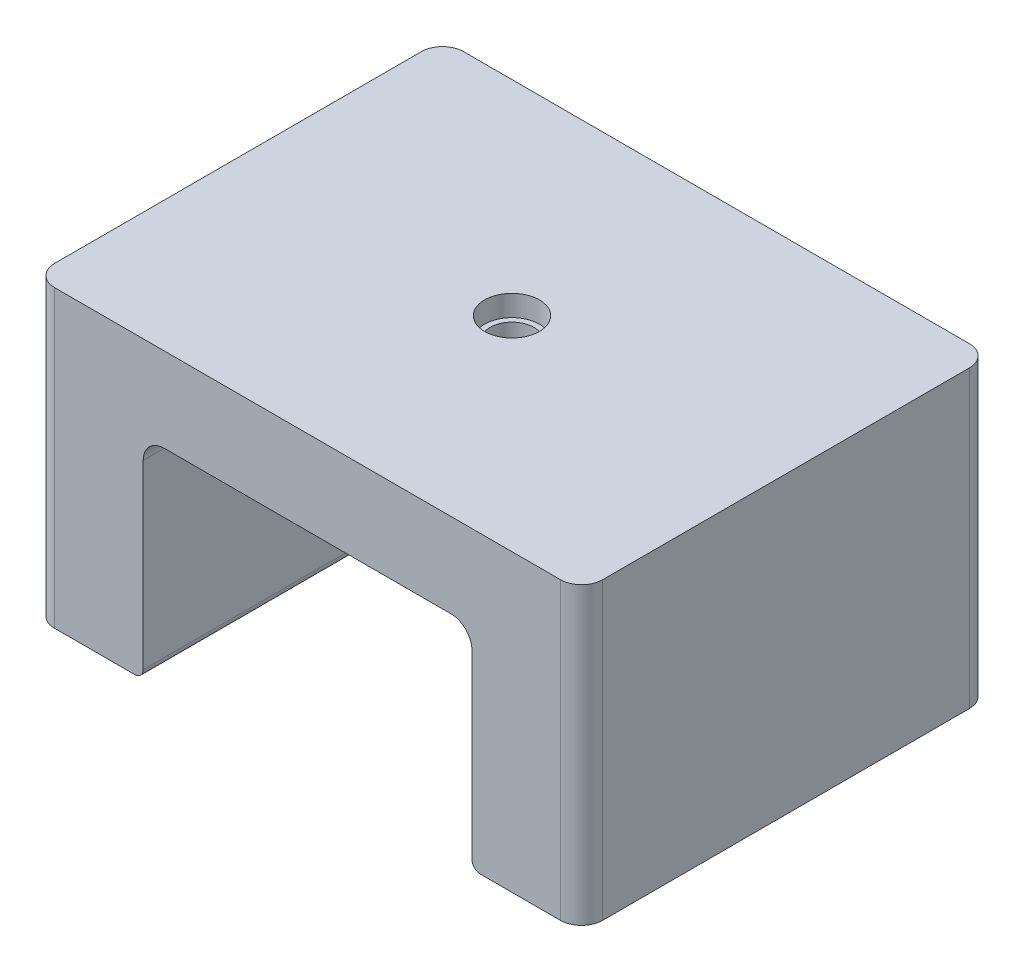
ISO-10303-21;
HEADER;
FILE_DESCRIPTION(('STEP AP214'),'2;1');
FILE_NAME('part.step','',(''),(''),'','','');
FILE_SCHEMA(('AUTOMOTIVE_DESIGN { 1 0 10303 214 1 1 1 1 }'));
ENDSEC;
DATA;
#1=APPLICATION_CONTEXT('core data for automotive mechanical design processes');
#2=APPLICATION_PROTOCOL_DEFINITION('international standard','automotive_design',2000,#1);
#3=PRODUCT_CONTEXT('',#1,'mechanical');
#4=PRODUCT('Part','Part','',(#3));
#5=PRODUCT_RELATED_PRODUCT_CATEGORY('part','',(#4));
#6=PRODUCT_DEFINITION_FORMATION('','',#4);
#7=PRODUCT_DEFINITION_CONTEXT('part definition',#1,'design');
#8=PRODUCT_DEFINITION('design','',#6,#7);
#9=PRODUCT_DEFINITION_SHAPE('','',#8);
#10=(LENGTH_UNIT() NAMED_UNIT(*) SI_UNIT(.MILLI.,.METRE.));
#11=(NAMED_UNIT(*) PLANE_ANGLE_UNIT() SI_UNIT($,.RADIAN.));
#12=(NAMED_UNIT(*) SI_UNIT($,.STERADIAN.) SOLID_ANGLE_UNIT());
#13=UNCERTAINTY_MEASURE_WITH_UNIT(LENGTH_MEASURE(1.E-05),#10,'distance_accuracy_value','');
#14=(GEOMETRIC_REPRESENTATION_CONTEXT(3) GLOBAL_UNCERTAINTY_ASSIGNED_CONTEXT((#13)) GLOBAL_UNIT_ASSIGNED_CONTEXT((#10,
#11,#12)) REPRESENTATION_CONTEXT('',''));
#15=CARTESIAN_POINT('',(0.,0.,0.));
#16=DIRECTION('',(0.,0.,1.));
#17=DIRECTION('',(1.,0.,0.));
#18=AXIS2_PLACEMENT_3D('',#15,#16,#17);
#19=CARTESIAN_POINT('',(0.,0.,0.));
#20=DIRECTION('',(0.,1.,0.));
#21=DIRECTION('',(0.,0.,1.));
#22=AXIS2_PLACEMENT_3D('',#19,#20,#21);
#23=CYLINDRICAL_SURFACE('',#22,5.2);
#24=CARTESIAN_POINT('',(0.,50.,0.));
#25=DIRECTION('',(0.,1.,0.));
#26=DIRECTION('',(0.,0.,1.));
#27=AXIS2_PLACEMENT_3D('',#24,#25,#26);
#28=CIRCLE('',#27,5.2);
#29=CARTESIAN_POINT('',(0.,50.,5.2));
#30=VERTEX_POINT('',#29);
#31=EDGE_CURVE('E223',#30,#30,#28,.T.);
#32=ORIENTED_EDGE('',*,*,#31,.F.);
#33=EDGE_LOOP('',(#32));
#34=FACE_BOUND('',#33,.T.);
#35=CARTESIAN_POINT('',(0.,65.,0.));
#36=DIRECTION('',(0.,1.,0.));
#37=DIRECTION('',(0.,0.,1.));
#38=AXIS2_PLACEMENT_3D('',#35,#36,#37);
#39=CIRCLE('',#38,5.2);
#40=CARTESIAN_POINT('',(0.,65.,5.2));
#41=VERTEX_POINT('',#40);
#42=EDGE_CURVE('E226',#41,#41,#39,.F.);
#43=ORIENTED_EDGE('',*,*,#42,.F.);
#44=EDGE_LOOP('',(#43));
#45=FACE_BOUND('',#44,.T.);
#46=ADVANCED_FACE('F39',(#34,#45),#23,.F.);
#47=CARTESIAN_POINT('',(0.,0.,0.));
#48=DIRECTION('',(0.,1.,0.));
#49=DIRECTION('',(0.,0.,1.));
#50=AXIS2_PLACEMENT_3D('',#47,#48,#49);
#51=PLANE('',#50);
#52=DIRECTION('',(-1.,0.,0.));
#53=VECTOR('',#52,1.);
#54=CARTESIAN_POINT('',(-65.,0.,-48.5));
#55=LINE('',#54,#53);
#56=CARTESIAN_POINT('',(-41.,0.,-48.5));
#57=VERTEX_POINT('',#56);
#58=CARTESIAN_POINT('',(-60.,0.,-48.5));
#59=VERTEX_POINT('',#58);
#60=EDGE_CURVE('E208',#57,#59,#55,.T.);
#61=ORIENTED_EDGE('',*,*,#60,.F.);
#62=DIRECTION('',(0.,0.,1.));
#63=VECTOR('',#62,1.);
#64=CARTESIAN_POINT('',(-41.,0.,0.));
#65=LINE('',#64,#63);
#66=CARTESIAN_POINT('',(-41.,0.,48.5));
#67=VERTEX_POINT('',#66);
#68=EDGE_CURVE('E47',#57,#67,#65,.T.);
#69=ORIENTED_EDGE('',*,*,#68,.T.);
#70=DIRECTION('',(1.,0.,0.));
#71=VECTOR('',#70,1.);
#72=CARTESIAN_POINT('',(-65.,0.,48.5));
#73=LINE('',#72,#71);
#74=CARTESIAN_POINT('',(-60.,0.,48.5));
#75=VERTEX_POINT('',#74);
#76=EDGE_CURVE('E201',#75,#67,#73,.T.);
#77=ORIENTED_EDGE('',*,*,#76,.F.);
#78=CARTESIAN_POINT('',(-60.,0.,43.5));
#79=DIRECTION('',(0.,1.,0.));
#80=DIRECTION('',(0.,0.,1.));
#81=AXIS2_PLACEMENT_3D('',#78,#79,#80);
#82=CIRCLE('',#81,5.);
#83=CARTESIAN_POINT('',(-65.,0.,43.5));
#84=VERTEX_POINT('',#83);
#85=EDGE_CURVE('E234',#75,#84,#82,.F.);
#86=ORIENTED_EDGE('',*,*,#85,.T.);
#87=DIRECTION('',(0.,0.,1.));
#88=VECTOR('',#87,1.);
#89=CARTESIAN_POINT('',(-65.,0.,48.5));
#90=LINE('',#89,#88);
#91=CARTESIAN_POINT('',(-65.,0.,-43.5));
#92=VERTEX_POINT('',#91);
#93=EDGE_CURVE('E192',#92,#84,#90,.T.);
#94=ORIENTED_EDGE('',*,*,#93,.F.);
#95=CARTESIAN_POINT('',(-60.,0.,-43.5));
#96=DIRECTION('',(0.,1.,0.));
#97=DIRECTION('',(0.,0.,1.));
#98=AXIS2_PLACEMENT_3D('',#95,#96,#97);
#99=CIRCLE('',#98,5.);
#100=EDGE_CURVE('E236',#92,#59,#99,.F.);
#101=ORIENTED_EDGE('',*,*,#100,.T.);
#102=EDGE_LOOP('',(#61,#69,#77,#86,#94,#101));
#103=FACE_BOUND('',#102,.T.);
#104=ADVANCED_FACE('F282',(#103),#51,.F.);
#105=CARTESIAN_POINT('',(-65.,70.,48.5));
#106=DIRECTION('',(0.,0.,-1.));
#107=DIRECTION('',(-1.,0.,0.));
#108=AXIS2_PLACEMENT_3D('',#105,#106,#107);
#109=PLANE('',#108);
#110=DIRECTION('',(0.,1.,0.));
#111=VECTOR('',#110,1.);
#112=CARTESIAN_POINT('',(39.,0.,48.5));
#113=LINE('',#112,#111);
#114=CARTESIAN_POINT('',(39.,2.,48.5));
#115=VERTEX_POINT('',#114);
#116=CARTESIAN_POINT('',(39.,45.,48.5));
#117=VERTEX_POINT('',#116);
#118=EDGE_CURVE('E180',#115,#117,#113,.T.);
#119=ORIENTED_EDGE('',*,*,#118,.F.);
#120=CARTESIAN_POINT('',(41.,2.,48.5));
#121=DIRECTION('',(0.,0.,-1.));
#122=DIRECTION('',(-1.,0.,0.));
#123=AXIS2_PLACEMENT_3D('',#120,#121,#122);
#124=CIRCLE('',#123,2.);
#125=CARTESIAN_POINT('',(41.,0.,48.5));
#126=VERTEX_POINT('',#125);
#127=EDGE_CURVE('E272',#115,#126,#124,.F.);
#128=ORIENTED_EDGE('',*,*,#127,.T.);
#129=CARTESIAN_POINT('',(60.,0.,48.5));
#130=VERTEX_POINT('',#129);
#131=EDGE_CURVE('E205',#126,#130,#73,.T.);
#132=ORIENTED_EDGE('',*,*,#131,.T.);
#133=DIRECTION('',(0.,-1.,0.));
#134=VECTOR('',#133,1.);
#135=CARTESIAN_POINT('',(60.,70.,48.5));
#136=LINE('',#135,#134);
#137=CARTESIAN_POINT('',(60.,70.,48.5));
#138=VERTEX_POINT('',#137);
#139=EDGE_CURVE('E252',#130,#138,#136,.F.);
#140=ORIENTED_EDGE('',*,*,#139,.T.);
#141=DIRECTION('',(1.,0.,0.));
#142=VECTOR('',#141,1.);
#143=CARTESIAN_POINT('',(-65.,70.,48.5));
#144=LINE('',#143,#142);
#145=CARTESIAN_POINT('',(-60.,70.,48.5));
#146=VERTEX_POINT('',#145);
#147=EDGE_CURVE('E188',#146,#138,#144,.T.);
#148=ORIENTED_EDGE('',*,*,#147,.F.);
#149=DIRECTION('',(0.,-1.,0.));
#150=VECTOR('',#149,1.);
#151=CARTESIAN_POINT('',(-60.,70.,48.5));
#152=LINE('',#151,#150);
#153=EDGE_CURVE('E254',#146,#75,#152,.T.);
#154=ORIENTED_EDGE('',*,*,#153,.T.);
#155=ORIENTED_EDGE('',*,*,#76,.T.);
#156=CARTESIAN_POINT('',(-41.,2.,48.5));
#157=DIRECTION('',(0.,0.,-1.));
#158=DIRECTION('',(-1.,0.,0.));
#159=AXIS2_PLACEMENT_3D('',#156,#157,#158);
#160=CIRCLE('',#159,2.);
#161=CARTESIAN_POINT('',(-39.,2.,48.5));
#162=VERTEX_POINT('',#161);
#163=EDGE_CURVE('E270',#67,#162,#160,.F.);
#164=ORIENTED_EDGE('',*,*,#163,.T.);
#165=DIRECTION('',(0.,-1.,0.));
#166=VECTOR('',#165,1.);
#167=CARTESIAN_POINT('',(-39.,0.,48.5));
#168=LINE('',#167,#166);
#169=CARTESIAN_POINT('',(-39.,45.,48.5));
#170=VERTEX_POINT('',#169);
#171=EDGE_CURVE('E184',#170,#162,#168,.T.);
#172=ORIENTED_EDGE('',*,*,#171,.F.);
#173=CARTESIAN_POINT('',(-34.,45.,48.5));
#174=DIRECTION('',(0.,0.,-1.));
#175=DIRECTION('',(-1.,0.,0.));
#176=AXIS2_PLACEMENT_3D('',#173,#174,#175);
#177=CIRCLE('',#176,5.);
#178=CARTESIAN_POINT('',(-34.,50.,48.5));
#179=VERTEX_POINT('',#178);
#180=EDGE_CURVE('E178',#170,#179,#177,.T.);
#181=ORIENTED_EDGE('',*,*,#180,.T.);
#182=DIRECTION('',(-1.,0.,0.));
#183=VECTOR('',#182,1.);
#184=CARTESIAN_POINT('',(-39.,50.,48.5));
#185=LINE('',#184,#183);
#186=CARTESIAN_POINT('',(34.,50.,48.5));
#187=VERTEX_POINT('',#186);
#188=EDGE_CURVE('E170',#187,#179,#185,.T.);
#189=ORIENTED_EDGE('',*,*,#188,.F.);
#190=CARTESIAN_POINT('',(34.,45.,48.5));
#191=DIRECTION('',(0.,0.,-1.));
#192=DIRECTION('',(-1.,0.,0.));
#193=AXIS2_PLACEMENT_3D('',#190,#191,#192);
#194=CIRCLE('',#193,5.);
#195=EDGE_CURVE('E153',#187,#117,#194,.T.);
#196=ORIENTED_EDGE('',*,*,#195,.T.);
#197=EDGE_LOOP('',(#119,#128,#132,#140,#148,#154,#155,#164,#172,#181,#189,#196));
#198=FACE_BOUND('',#197,.T.);
#199=ADVANCED_FACE('F176',(#198),#109,.F.);
#200=CARTESIAN_POINT('',(65.,70.,48.5));
#201=DIRECTION('',(-1.,0.,0.));
#202=DIRECTION('',(0.,0.,1.));
#203=AXIS2_PLACEMENT_3D('',#200,#201,#202);
#204=PLANE('',#203);
#205=DIRECTION('',(0.,0.,-1.));
#206=VECTOR('',#205,1.);
#207=CARTESIAN_POINT('',(65.,0.,48.5));
#208=LINE('',#207,#206);
#209=CARTESIAN_POINT('',(65.,0.,43.5));
#210=VERTEX_POINT('',#209);
#211=CARTESIAN_POINT('',(65.,0.,-43.5));
#212=VERTEX_POINT('',#211);
#213=EDGE_CURVE('E204',#210,#212,#208,.T.);
#214=ORIENTED_EDGE('',*,*,#213,.T.);
#215=DIRECTION('',(0.,-1.,0.));
#216=VECTOR('',#215,1.);
#217=CARTESIAN_POINT('',(65.,70.,-43.5));
#218=LINE('',#217,#216);
#219=CARTESIAN_POINT('',(65.,70.,-43.5));
#220=VERTEX_POINT('',#219);
#221=EDGE_CURVE('E265',#212,#220,#218,.F.);
#222=ORIENTED_EDGE('',*,*,#221,.T.);
#223=DIRECTION('',(0.,0.,-1.));
#224=VECTOR('',#223,1.);
#225=CARTESIAN_POINT('',(65.,70.,48.5));
#226=LINE('',#225,#224);
#227=CARTESIAN_POINT('',(65.,70.,43.5));
#228=VERTEX_POINT('',#227);
#229=EDGE_CURVE('E191',#228,#220,#226,.T.);
#230=ORIENTED_EDGE('',*,*,#229,.F.);
#231=DIRECTION('',(0.,-1.,0.));
#232=VECTOR('',#231,1.);
#233=CARTESIAN_POINT('',(65.,70.,43.5));
#234=LINE('',#233,#232);
#235=EDGE_CURVE('E262',#228,#210,#234,.T.);
#236=ORIENTED_EDGE('',*,*,#235,.T.);
#237=EDGE_LOOP('',(#214,#222,#230,#236));
#238=FACE_BOUND('',#237,.T.);
#239=ADVANCED_FACE('F361',(#238),#204,.F.);
#240=CARTESIAN_POINT('',(-65.,70.,-48.5));
#241=DIRECTION('',(0.,0.,1.));
#242=DIRECTION('',(1.,0.,0.));
#243=AXIS2_PLACEMENT_3D('',#240,#241,#242);
#244=PLANE('',#243);
#245=CARTESIAN_POINT('',(60.,0.,-48.5));
#246=VERTEX_POINT('',#245);
#247=CARTESIAN_POINT('',(41.,0.,-48.5));
#248=VERTEX_POINT('',#247);
#249=EDGE_CURVE('E209',#246,#248,#55,.T.);
#250=ORIENTED_EDGE('',*,*,#249,.T.);
#251=CARTESIAN_POINT('',(41.,2.,-48.5));
#252=DIRECTION('',(0.,0.,1.));
#253=DIRECTION('',(1.,0.,0.));
#254=AXIS2_PLACEMENT_3D('',#251,#252,#253);
#255=CIRCLE('',#254,2.);
#256=CARTESIAN_POINT('',(39.,2.,-48.5));
#257=VERTEX_POINT('',#256);
#258=EDGE_CURVE('E277',#248,#257,#255,.F.);
#259=ORIENTED_EDGE('',*,*,#258,.T.);
#260=DIRECTION('',(0.,1.,0.));
#261=VECTOR('',#260,1.);
#262=CARTESIAN_POINT('',(39.,0.,-48.5));
#263=LINE('',#262,#261);
#264=CARTESIAN_POINT('',(39.,45.,-48.5));
#265=VERTEX_POINT('',#264);
#266=EDGE_CURVE('E182',#257,#265,#263,.T.);
#267=ORIENTED_EDGE('',*,*,#266,.T.);
#268=CARTESIAN_POINT('',(34.,45.,-48.5));
#269=DIRECTION('',(0.,0.,1.));
#270=DIRECTION('',(1.,0.,0.));
#271=AXIS2_PLACEMENT_3D('',#268,#269,#270);
#272=CIRCLE('',#271,5.);
#273=CARTESIAN_POINT('',(34.,50.,-48.5));
#274=VERTEX_POINT('',#273);
#275=EDGE_CURVE('E163',#265,#274,#272,.T.);
#276=ORIENTED_EDGE('',*,*,#275,.T.);
#277=DIRECTION('',(-1.,0.,0.));
#278=VECTOR('',#277,1.);
#279=CARTESIAN_POINT('',(-39.,50.,-48.5));
#280=LINE('',#279,#278);
#281=CARTESIAN_POINT('',(-34.,50.,-48.5));
#282=VERTEX_POINT('',#281);
#283=EDGE_CURVE('E173',#274,#282,#280,.T.);
#284=ORIENTED_EDGE('',*,*,#283,.T.);
#285=CARTESIAN_POINT('',(-34.,45.,-48.5));
#286=DIRECTION('',(0.,0.,1.));
#287=DIRECTION('',(1.,0.,0.));
#288=AXIS2_PLACEMENT_3D('',#285,#286,#287);
#289=CIRCLE('',#288,5.);
#290=CARTESIAN_POINT('',(-39.,45.,-48.5));
#291=VERTEX_POINT('',#290);
#292=EDGE_CURVE('E220',#282,#291,#289,.T.);
#293=ORIENTED_EDGE('',*,*,#292,.T.);
#294=DIRECTION('',(0.,-1.,0.));
#295=VECTOR('',#294,1.);
#296=CARTESIAN_POINT('',(-39.,0.,-48.5));
#297=LINE('',#296,#295);
#298=CARTESIAN_POINT('',(-39.,2.,-48.5));
#299=VERTEX_POINT('',#298);
#300=EDGE_CURVE('E179',#291,#299,#297,.T.);
#301=ORIENTED_EDGE('',*,*,#300,.T.);
#302=CARTESIAN_POINT('',(-41.,2.,-48.5));
#303=DIRECTION('',(0.,0.,1.));
#304=DIRECTION('',(1.,0.,0.));
#305=AXIS2_PLACEMENT_3D('',#302,#303,#304);
#306=CIRCLE('',#305,2.);
#307=EDGE_CURVE('E59',#299,#57,#306,.F.);
#308=ORIENTED_EDGE('',*,*,#307,.T.);
#309=ORIENTED_EDGE('',*,*,#60,.T.);
#310=DIRECTION('',(0.,-1.,0.));
#311=VECTOR('',#310,1.);
#312=CARTESIAN_POINT('',(-60.,70.,-48.5));
#313=LINE('',#312,#311);
#314=CARTESIAN_POINT('',(-60.,70.,-48.5));
#315=VERTEX_POINT('',#314);
#316=EDGE_CURVE('E242',#59,#315,#313,.F.);
#317=ORIENTED_EDGE('',*,*,#316,.T.);
#318=DIRECTION('',(-1.,0.,0.));
#319=VECTOR('',#318,1.);
#320=CARTESIAN_POINT('',(-65.,70.,-48.5));
#321=LINE('',#320,#319);
#322=CARTESIAN_POINT('',(60.,70.,-48.5));
#323=VERTEX_POINT('',#322);
#324=EDGE_CURVE('E195',#323,#315,#321,.T.);
#325=ORIENTED_EDGE('',*,*,#324,.F.);
#326=DIRECTION('',(0.,-1.,0.));
#327=VECTOR('',#326,1.);
#328=CARTESIAN_POINT('',(60.,70.,-48.5));
#329=LINE('',#328,#327);
#330=EDGE_CURVE('E239',#323,#246,#329,.T.);
#331=ORIENTED_EDGE('',*,*,#330,.T.);
#332=EDGE_LOOP('',(#250,#259,#267,#276,#284,#293,#301,#308,#309,#317,#325,#331));
#333=FACE_BOUND('',#332,.T.);
#334=ADVANCED_FACE('F300',(#333),#244,.F.);
#335=CARTESIAN_POINT('',(-65.,70.,48.5));
#336=DIRECTION('',(1.,0.,0.));
#337=DIRECTION('',(0.,0.,-1.));
#338=AXIS2_PLACEMENT_3D('',#335,#336,#337);
#339=PLANE('',#338);
#340=DIRECTION('',(0.,0.,1.));
#341=VECTOR('',#340,1.);
#342=CARTESIAN_POINT('',(-65.,70.,48.5));
#343=LINE('',#342,#341);
#344=CARTESIAN_POINT('',(-65.,70.,-43.5));
#345=VERTEX_POINT('',#344);
#346=CARTESIAN_POINT('',(-65.,70.,43.5));
#347=VERTEX_POINT('',#346);
#348=EDGE_CURVE('E198',#345,#347,#343,.T.);
#349=ORIENTED_EDGE('',*,*,#348,.F.);
#350=DIRECTION('',(0.,-1.,0.));
#351=VECTOR('',#350,1.);
#352=CARTESIAN_POINT('',(-65.,70.,-43.5));
#353=LINE('',#352,#351);
#354=EDGE_CURVE('E231',#345,#92,#353,.T.);
#355=ORIENTED_EDGE('',*,*,#354,.T.);
#356=ORIENTED_EDGE('',*,*,#93,.T.);
#357=DIRECTION('',(0.,-1.,0.));
#358=VECTOR('',#357,1.);
#359=CARTESIAN_POINT('',(-65.,70.,43.5));
#360=LINE('',#359,#358);
#361=EDGE_CURVE('E222',#84,#347,#360,.F.);
#362=ORIENTED_EDGE('',*,*,#361,.T.);
#363=EDGE_LOOP('',(#349,#355,#356,#362));
#364=FACE_BOUND('',#363,.T.);
#365=ADVANCED_FACE('F293',(#364),#339,.F.);
#366=CARTESIAN_POINT('',(0.,70.,0.));
#367=DIRECTION('',(0.,1.,0.));
#368=DIRECTION('',(0.,0.,1.));
#369=AXIS2_PLACEMENT_3D('',#366,#367,#368);
#370=PLANE('',#369);
#371=CARTESIAN_POINT('',(0.,70.,0.));
#372=DIRECTION('',(0.,1.,0.));
#373=DIRECTION('',(0.,0.,1.));
#374=AXIS2_PLACEMENT_3D('',#371,#372,#373);
#375=CIRCLE('',#374,6.5);
#376=CARTESIAN_POINT('',(0.,70.,6.5));
#377=VERTEX_POINT('',#376);
#378=EDGE_CURVE('E512',#377,#377,#375,.T.);
#379=ORIENTED_EDGE('',*,*,#378,.F.);
#380=EDGE_LOOP('',(#379));
#381=FACE_BOUND('',#380,.T.);
#382=ORIENTED_EDGE('',*,*,#324,.T.);
#383=CARTESIAN_POINT('',(-60.,70.,-43.5));
#384=DIRECTION('',(0.,1.,0.));
#385=DIRECTION('',(0.,0.,1.));
#386=AXIS2_PLACEMENT_3D('',#383,#384,#385);
#387=CIRCLE('',#386,5.);
#388=EDGE_CURVE('E250',#315,#345,#387,.T.);
#389=ORIENTED_EDGE('',*,*,#388,.T.);
#390=ORIENTED_EDGE('',*,*,#348,.T.);
#391=CARTESIAN_POINT('',(-60.,70.,43.5));
#392=DIRECTION('',(0.,1.,0.));
#393=DIRECTION('',(0.,0.,1.));
#394=AXIS2_PLACEMENT_3D('',#391,#392,#393);
#395=CIRCLE('',#394,5.);
#396=EDGE_CURVE('E248',#347,#146,#395,.T.);
#397=ORIENTED_EDGE('',*,*,#396,.T.);
#398=ORIENTED_EDGE('',*,*,#147,.T.);
#399=CARTESIAN_POINT('',(60.,70.,43.5));
#400=DIRECTION('',(0.,1.,0.));
#401=DIRECTION('',(0.,0.,1.));
#402=AXIS2_PLACEMENT_3D('',#399,#400,#401);
#403=CIRCLE('',#402,5.);
#404=EDGE_CURVE('E244',#138,#228,#403,.T.);
#405=ORIENTED_EDGE('',*,*,#404,.T.);
#406=ORIENTED_EDGE('',*,*,#229,.T.);
#407=CARTESIAN_POINT('',(60.,70.,-43.5));
#408=DIRECTION('',(0.,1.,0.));
#409=DIRECTION('',(0.,0.,1.));
#410=AXIS2_PLACEMENT_3D('',#407,#408,#409);
#411=CIRCLE('',#410,5.);
#412=EDGE_CURVE('E246',#220,#323,#411,.T.);
#413=ORIENTED_EDGE('',*,*,#412,.T.);
#414=EDGE_LOOP('',(#382,#389,#390,#397,#398,#405,#406,#413));
#415=FACE_BOUND('',#414,.T.);
#416=ADVANCED_FACE('F303',(#381,#415),#370,.T.);
#417=ORIENTED_EDGE('',*,*,#131,.F.);
#418=DIRECTION('',(0.,0.,1.));
#419=VECTOR('',#418,1.);
#420=CARTESIAN_POINT('',(41.,0.,0.));
#421=LINE('',#420,#419);
#422=EDGE_CURVE('E274',#126,#248,#421,.F.);
#423=ORIENTED_EDGE('',*,*,#422,.T.);
#424=ORIENTED_EDGE('',*,*,#249,.F.);
#425=CARTESIAN_POINT('',(60.,0.,-43.5));
#426=DIRECTION('',(0.,1.,0.));
#427=DIRECTION('',(0.,0.,1.));
#428=AXIS2_PLACEMENT_3D('',#425,#426,#427);
#429=CIRCLE('',#428,5.);
#430=EDGE_CURVE('E260',#246,#212,#429,.F.);
#431=ORIENTED_EDGE('',*,*,#430,.T.);
#432=ORIENTED_EDGE('',*,*,#213,.F.);
#433=CARTESIAN_POINT('',(60.,0.,43.5));
#434=DIRECTION('',(0.,1.,0.));
#435=DIRECTION('',(0.,0.,1.));
#436=AXIS2_PLACEMENT_3D('',#433,#434,#435);
#437=CIRCLE('',#436,5.);
#438=EDGE_CURVE('E257',#210,#130,#437,.F.);
#439=ORIENTED_EDGE('',*,*,#438,.T.);
#440=EDGE_LOOP('',(#417,#423,#424,#431,#432,#439));
#441=FACE_BOUND('',#440,.T.);
#442=ADVANCED_FACE('F313',(#441),#51,.F.);
#443=CARTESIAN_POINT('',(-39.,0.,-48.5));
#444=DIRECTION('',(-1.,0.,0.));
#445=DIRECTION('',(0.,0.,1.));
#446=AXIS2_PLACEMENT_3D('',#443,#444,#445);
#447=PLANE('',#446);
#448=ORIENTED_EDGE('',*,*,#171,.T.);
#449=DIRECTION('',(0.,0.,1.));
#450=VECTOR('',#449,1.);
#451=CARTESIAN_POINT('',(-39.,2.,-48.5));
#452=LINE('',#451,#450);
#453=EDGE_CURVE('E11',#162,#299,#452,.F.);
#454=ORIENTED_EDGE('',*,*,#453,.T.);
#455=ORIENTED_EDGE('',*,*,#300,.F.);
#456=DIRECTION('',(0.,0.,1.));
#457=VECTOR('',#456,1.);
#458=CARTESIAN_POINT('',(-39.,45.,48.5));
#459=LINE('',#458,#457);
#460=EDGE_CURVE('E164',#291,#170,#459,.T.);
#461=ORIENTED_EDGE('',*,*,#460,.T.);
#462=EDGE_LOOP('',(#448,#454,#455,#461));
#463=FACE_BOUND('',#462,.T.);
#464=ADVANCED_FACE('F325',(#463),#447,.F.);
#465=CARTESIAN_POINT('',(-39.,50.,-48.5));
#466=DIRECTION('',(0.,1.,0.));
#467=DIRECTION('',(0.,0.,1.));
#468=AXIS2_PLACEMENT_3D('',#465,#466,#467);
#469=PLANE('',#468);
#470=ORIENTED_EDGE('',*,*,#31,.T.);
#471=EDGE_LOOP('',(#470));
#472=FACE_BOUND('',#471,.T.);
#473=ORIENTED_EDGE('',*,*,#283,.F.);
#474=DIRECTION('',(0.,0.,1.));
#475=VECTOR('',#474,1.);
#476=CARTESIAN_POINT('',(34.,50.,48.5));
#477=LINE('',#476,#475);
#478=EDGE_CURVE('E157',#274,#187,#477,.T.);
#479=ORIENTED_EDGE('',*,*,#478,.T.);
#480=ORIENTED_EDGE('',*,*,#188,.T.);
#481=DIRECTION('',(0.,0.,1.));
#482=VECTOR('',#481,1.);
#483=CARTESIAN_POINT('',(-34.,50.,-48.5));
#484=LINE('',#483,#482);
#485=EDGE_CURVE('E174',#179,#282,#484,.F.);
#486=ORIENTED_EDGE('',*,*,#485,.T.);
#487=EDGE_LOOP('',(#473,#479,#480,#486));
#488=FACE_BOUND('',#487,.T.);
#489=ADVANCED_FACE('F169',(#472,#488),#469,.F.);
#490=CARTESIAN_POINT('',(39.,0.,-48.5));
#491=DIRECTION('',(1.,0.,0.));
#492=DIRECTION('',(0.,0.,-1.));
#493=AXIS2_PLACEMENT_3D('',#490,#491,#492);
#494=PLANE('',#493);
#495=ORIENTED_EDGE('',*,*,#266,.F.);
#496=DIRECTION('',(0.,0.,1.));
#497=VECTOR('',#496,1.);
#498=CARTESIAN_POINT('',(39.,2.,-48.5));
#499=LINE('',#498,#497);
#500=EDGE_CURVE('E267',#257,#115,#499,.T.);
#501=ORIENTED_EDGE('',*,*,#500,.T.);
#502=ORIENTED_EDGE('',*,*,#118,.T.);
#503=DIRECTION('',(0.,0.,1.));
#504=VECTOR('',#503,1.);
#505=CARTESIAN_POINT('',(39.,45.,-48.5));
#506=LINE('',#505,#504);
#507=EDGE_CURVE('E159',#117,#265,#506,.F.);
#508=ORIENTED_EDGE('',*,*,#507,.T.);
#509=EDGE_LOOP('',(#495,#501,#502,#508));
#510=FACE_BOUND('',#509,.T.);
#511=ADVANCED_FACE('F321',(#510),#494,.F.);
#512=CARTESIAN_POINT('',(34.,45.,-48.5));
#513=DIRECTION('',(0.,0.,-1.));
#514=DIRECTION('',(-1.,0.,0.));
#515=AXIS2_PLACEMENT_3D('',#512,#513,#514);
#516=CYLINDRICAL_SURFACE('',#515,5.);
#517=ORIENTED_EDGE('',*,*,#275,.F.);
#518=ORIENTED_EDGE('',*,*,#507,.F.);
#519=ORIENTED_EDGE('',*,*,#195,.F.);
#520=ORIENTED_EDGE('',*,*,#478,.F.);
#521=EDGE_LOOP('',(#517,#518,#519,#520));
#522=FACE_BOUND('',#521,.T.);
#523=ADVANCED_FACE('F156',(#522),#516,.F.);
#524=CARTESIAN_POINT('',(-34.,45.,-48.5));
#525=DIRECTION('',(0.,0.,-1.));
#526=DIRECTION('',(-1.,0.,0.));
#527=AXIS2_PLACEMENT_3D('',#524,#525,#526);
#528=CYLINDRICAL_SURFACE('',#527,5.);
#529=ORIENTED_EDGE('',*,*,#292,.F.);
#530=ORIENTED_EDGE('',*,*,#485,.F.);
#531=ORIENTED_EDGE('',*,*,#180,.F.);
#532=ORIENTED_EDGE('',*,*,#460,.F.);
#533=EDGE_LOOP('',(#529,#530,#531,#532));
#534=FACE_BOUND('',#533,.T.);
#535=ADVANCED_FACE('F369',(#534),#528,.F.);
#536=CARTESIAN_POINT('',(0.,65.,0.));
#537=DIRECTION('',(0.,1.,0.));
#538=DIRECTION('',(0.,0.,1.));
#539=AXIS2_PLACEMENT_3D('',#536,#537,#538);
#540=PLANE('',#539);
#541=CARTESIAN_POINT('',(0.,65.,0.));
#542=DIRECTION('',(0.,1.,0.));
#543=DIRECTION('',(0.,0.,1.));
#544=AXIS2_PLACEMENT_3D('',#541,#542,#543);
#545=CIRCLE('',#544,6.5);
#546=CARTESIAN_POINT('',(0.,65.,6.5));
#547=VERTEX_POINT('',#546);
#548=EDGE_CURVE('E229',#547,#547,#545,.T.);
#549=ORIENTED_EDGE('',*,*,#548,.T.);
#550=EDGE_LOOP('',(#549));
#551=FACE_BOUND('',#550,.T.);
#552=ORIENTED_EDGE('',*,*,#42,.T.);
#553=EDGE_LOOP('',(#552));
#554=FACE_BOUND('',#553,.T.);
#555=ADVANCED_FACE('F372',(#551,#554),#540,.T.);
#556=CARTESIAN_POINT('',(0.,65.,0.));
#557=DIRECTION('',(0.,1.,0.));
#558=DIRECTION('',(0.,0.,1.));
#559=AXIS2_PLACEMENT_3D('',#556,#557,#558);
#560=CYLINDRICAL_SURFACE('',#559,6.5);
#561=ORIENTED_EDGE('',*,*,#548,.F.);
#562=EDGE_LOOP('',(#561));
#563=FACE_BOUND('',#562,.T.);
#564=ORIENTED_EDGE('',*,*,#378,.T.);
#565=EDGE_LOOP('',(#564));
#566=FACE_BOUND('',#565,.T.);
#567=ADVANCED_FACE('F345',(#563,#566),#560,.F.);
#568=CARTESIAN_POINT('',(-60.,70.,-43.5));
#569=DIRECTION('',(0.,-1.,0.));
#570=DIRECTION('',(0.,0.,-1.));
#571=AXIS2_PLACEMENT_3D('',#568,#569,#570);
#572=CYLINDRICAL_SURFACE('',#571,5.);
#573=ORIENTED_EDGE('',*,*,#388,.F.);
#574=ORIENTED_EDGE('',*,*,#316,.F.);
#575=ORIENTED_EDGE('',*,*,#100,.F.);
#576=ORIENTED_EDGE('',*,*,#354,.F.);
#577=EDGE_LOOP('',(#573,#574,#575,#576));
#578=FACE_BOUND('',#577,.T.);
#579=ADVANCED_FACE('F297',(#578),#572,.T.);
#580=CARTESIAN_POINT('',(-60.,70.,43.5));
#581=DIRECTION('',(0.,-1.,0.));
#582=DIRECTION('',(0.,0.,-1.));
#583=AXIS2_PLACEMENT_3D('',#580,#581,#582);
#584=CYLINDRICAL_SURFACE('',#583,5.);
#585=ORIENTED_EDGE('',*,*,#396,.F.);
#586=ORIENTED_EDGE('',*,*,#361,.F.);
#587=ORIENTED_EDGE('',*,*,#85,.F.);
#588=ORIENTED_EDGE('',*,*,#153,.F.);
#589=EDGE_LOOP('',(#585,#586,#587,#588));
#590=FACE_BOUND('',#589,.T.);
#591=ADVANCED_FACE('F288',(#590),#584,.T.);
#592=CARTESIAN_POINT('',(60.,70.,-43.5));
#593=DIRECTION('',(0.,-1.,0.));
#594=DIRECTION('',(0.,0.,-1.));
#595=AXIS2_PLACEMENT_3D('',#592,#593,#594);
#596=CYLINDRICAL_SURFACE('',#595,5.);
#597=ORIENTED_EDGE('',*,*,#412,.F.);
#598=ORIENTED_EDGE('',*,*,#221,.F.);
#599=ORIENTED_EDGE('',*,*,#430,.F.);
#600=ORIENTED_EDGE('',*,*,#330,.F.);
#601=EDGE_LOOP('',(#597,#598,#599,#600));
#602=FACE_BOUND('',#601,.T.);
#603=ADVANCED_FACE('F308',(#602),#596,.T.);
#604=CARTESIAN_POINT('',(60.,70.,43.5));
#605=DIRECTION('',(0.,-1.,0.));
#606=DIRECTION('',(0.,0.,-1.));
#607=AXIS2_PLACEMENT_3D('',#604,#605,#606);
#608=CYLINDRICAL_SURFACE('',#607,5.);
#609=ORIENTED_EDGE('',*,*,#404,.F.);
#610=ORIENTED_EDGE('',*,*,#139,.F.);
#611=ORIENTED_EDGE('',*,*,#438,.F.);
#612=ORIENTED_EDGE('',*,*,#235,.F.);
#613=EDGE_LOOP('',(#609,#610,#611,#612));
#614=FACE_BOUND('',#613,.T.);
#615=ADVANCED_FACE('F331',(#614),#608,.T.);
#616=CARTESIAN_POINT('',(41.,2.,-48.5));
#617=DIRECTION('',(0.,0.,1.));
#618=DIRECTION('',(1.,0.,0.));
#619=AXIS2_PLACEMENT_3D('',#616,#617,#618);
#620=CYLINDRICAL_SURFACE('',#619,2.);
#621=ORIENTED_EDGE('',*,*,#258,.F.);
#622=ORIENTED_EDGE('',*,*,#422,.F.);
#623=ORIENTED_EDGE('',*,*,#127,.F.);
#624=ORIENTED_EDGE('',*,*,#500,.F.);
#625=EDGE_LOOP('',(#621,#622,#623,#624));
#626=FACE_BOUND('',#625,.T.);
#627=ADVANCED_FACE('F317',(#626),#620,.T.);
#628=CARTESIAN_POINT('',(-41.,2.,0.));
#629=DIRECTION('',(0.,0.,1.));
#630=DIRECTION('',(1.,0.,0.));
#631=AXIS2_PLACEMENT_3D('',#628,#629,#630);
#632=CYLINDRICAL_SURFACE('',#631,2.);
#633=ORIENTED_EDGE('',*,*,#307,.F.);
#634=ORIENTED_EDGE('',*,*,#453,.F.);
#635=ORIENTED_EDGE('',*,*,#163,.F.);
#636=ORIENTED_EDGE('',*,*,#68,.F.);
#637=EDGE_LOOP('',(#633,#634,#635,#636));
#638=FACE_BOUND('',#637,.T.);
#639=ADVANCED_FACE('F41',(#638),#632,.T.);
#640=CLOSED_SHELL('',(#46,#104,#199,#239,#334,#365,#416,#442,#464,#489,#511,#523,#535,#555,#567,
#579,#591,#603,#615,#627,#639));
#641=MANIFOLD_SOLID_BREP('B2',#640);
#642=ADVANCED_BREP_SHAPE_REPRESENTATION('',(#18,#641),#14);
#643=SHAPE_DEFINITION_REPRESENTATION(#9,#642);
ENDSEC;
END-ISO-10303-21;
